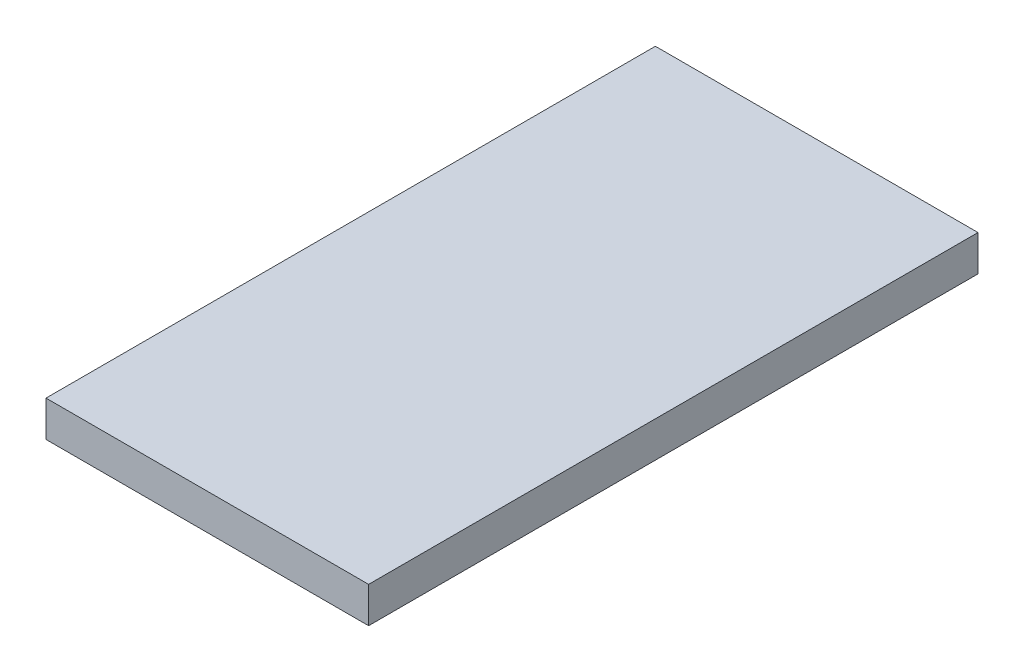
ISO-10303-21;
HEADER;
FILE_DESCRIPTION(('STEP AP214'),'2;1');
FILE_NAME('part.step','',(''),(''),'','','');
FILE_SCHEMA(('AUTOMOTIVE_DESIGN { 1 0 10303 214 1 1 1 1 }'));
ENDSEC;
DATA;
#1=APPLICATION_CONTEXT('core data for automotive mechanical design processes');
#2=APPLICATION_PROTOCOL_DEFINITION('international standard','automotive_design',2000,#1);
#3=PRODUCT_CONTEXT('',#1,'mechanical');
#4=PRODUCT('Part','Part','',(#3));
#5=PRODUCT_RELATED_PRODUCT_CATEGORY('part','',(#4));
#6=PRODUCT_DEFINITION_FORMATION('','',#4);
#7=PRODUCT_DEFINITION_CONTEXT('part definition',#1,'design');
#8=PRODUCT_DEFINITION('design','',#6,#7);
#9=PRODUCT_DEFINITION_SHAPE('','',#8);
#10=(LENGTH_UNIT() NAMED_UNIT(*) SI_UNIT(.MILLI.,.METRE.));
#11=(NAMED_UNIT(*) PLANE_ANGLE_UNIT() SI_UNIT($,.RADIAN.));
#12=(NAMED_UNIT(*) SI_UNIT($,.STERADIAN.) SOLID_ANGLE_UNIT());
#13=UNCERTAINTY_MEASURE_WITH_UNIT(LENGTH_MEASURE(1.E-05),#10,'distance_accuracy_value','');
#14=(GEOMETRIC_REPRESENTATION_CONTEXT(3) GLOBAL_UNCERTAINTY_ASSIGNED_CONTEXT((#13)) GLOBAL_UNIT_ASSIGNED_CONTEXT((#10,
#11,#12)) REPRESENTATION_CONTEXT('',''));
#15=CARTESIAN_POINT('',(0.,0.,0.));
#16=DIRECTION('',(0.,0.,1.));
#17=DIRECTION('',(1.,0.,0.));
#18=AXIS2_PLACEMENT_3D('',#15,#16,#17);
#19=CARTESIAN_POINT('',(-90.,0.,-340.));
#20=DIRECTION('',(-1.,0.,0.));
#21=DIRECTION('',(0.,0.,1.));
#22=AXIS2_PLACEMENT_3D('',#19,#20,#21);
#23=PLANE('',#22);
#24=DIRECTION('',(0.,-1.,0.));
#25=VECTOR('',#24,1.);
#26=CARTESIAN_POINT('',(-90.,0.,0.));
#27=LINE('',#26,#25);
#28=CARTESIAN_POINT('',(-90.,20.,0.));
#29=VERTEX_POINT('',#28);
#30=CARTESIAN_POINT('',(-90.,0.,0.));
#31=VERTEX_POINT('',#30);
#32=EDGE_CURVE('E103',#29,#31,#27,.T.);
#33=ORIENTED_EDGE('',*,*,#32,.F.);
#34=DIRECTION('',(0.,0.,1.));
#35=VECTOR('',#34,1.);
#36=CARTESIAN_POINT('',(-90.,20.,-340.));
#37=LINE('',#36,#35);
#38=CARTESIAN_POINT('',(-90.,20.,-340.));
#39=VERTEX_POINT('',#38);
#40=EDGE_CURVE('E11',#39,#29,#37,.T.);
#41=ORIENTED_EDGE('',*,*,#40,.F.);
#42=DIRECTION('',(0.,-1.,0.));
#43=VECTOR('',#42,1.);
#44=CARTESIAN_POINT('',(-90.,0.,-340.));
#45=LINE('',#44,#43);
#46=CARTESIAN_POINT('',(-90.,0.,-340.));
#47=VERTEX_POINT('',#46);
#48=EDGE_CURVE('E97',#39,#47,#45,.T.);
#49=ORIENTED_EDGE('',*,*,#48,.T.);
#50=DIRECTION('',(0.,0.,1.));
#51=VECTOR('',#50,1.);
#52=CARTESIAN_POINT('',(-90.,0.,-340.));
#53=LINE('',#52,#51);
#54=EDGE_CURVE('E42',#47,#31,#53,.T.);
#55=ORIENTED_EDGE('',*,*,#54,.T.);
#56=EDGE_LOOP('',(#33,#41,#49,#55));
#57=FACE_BOUND('',#56,.T.);
#58=ADVANCED_FACE('F39',(#57),#23,.T.);
#59=CARTESIAN_POINT('',(-90.,20.,-340.));
#60=DIRECTION('',(0.,1.,0.));
#61=DIRECTION('',(0.,0.,1.));
#62=AXIS2_PLACEMENT_3D('',#59,#60,#61);
#63=PLANE('',#62);
#64=DIRECTION('',(-1.,0.,0.));
#65=VECTOR('',#64,1.);
#66=CARTESIAN_POINT('',(-90.,20.,0.));
#67=LINE('',#66,#65);
#68=CARTESIAN_POINT('',(90.,20.,0.));
#69=VERTEX_POINT('',#68);
#70=EDGE_CURVE('E99',#69,#29,#67,.T.);
#71=ORIENTED_EDGE('',*,*,#70,.F.);
#72=DIRECTION('',(0.,0.,1.));
#73=VECTOR('',#72,1.);
#74=CARTESIAN_POINT('',(90.,20.,-340.));
#75=LINE('',#74,#73);
#76=CARTESIAN_POINT('',(90.,20.,-340.));
#77=VERTEX_POINT('',#76);
#78=EDGE_CURVE('E48',#77,#69,#75,.T.);
#79=ORIENTED_EDGE('',*,*,#78,.F.);
#80=DIRECTION('',(-1.,0.,0.));
#81=VECTOR('',#80,1.);
#82=CARTESIAN_POINT('',(-90.,20.,-340.));
#83=LINE('',#82,#81);
#84=EDGE_CURVE('E94',#77,#39,#83,.T.);
#85=ORIENTED_EDGE('',*,*,#84,.T.);
#86=ORIENTED_EDGE('',*,*,#40,.T.);
#87=EDGE_LOOP('',(#71,#79,#85,#86));
#88=FACE_BOUND('',#87,.T.);
#89=ADVANCED_FACE('F113',(#88),#63,.T.);
#90=CARTESIAN_POINT('',(90.,0.,-340.));
#91=DIRECTION('',(1.,0.,0.));
#92=DIRECTION('',(0.,0.,-1.));
#93=AXIS2_PLACEMENT_3D('',#90,#91,#92);
#94=PLANE('',#93);
#95=DIRECTION('',(0.,1.,0.));
#96=VECTOR('',#95,1.);
#97=CARTESIAN_POINT('',(90.,0.,0.));
#98=LINE('',#97,#96);
#99=CARTESIAN_POINT('',(90.,0.,0.));
#100=VERTEX_POINT('',#99);
#101=EDGE_CURVE('E89',#100,#69,#98,.T.);
#102=ORIENTED_EDGE('',*,*,#101,.F.);
#103=DIRECTION('',(0.,0.,1.));
#104=VECTOR('',#103,1.);
#105=CARTESIAN_POINT('',(90.,0.,-340.));
#106=LINE('',#105,#104);
#107=CARTESIAN_POINT('',(90.,0.,-340.));
#108=VERTEX_POINT('',#107);
#109=EDGE_CURVE('E84',#108,#100,#106,.T.);
#110=ORIENTED_EDGE('',*,*,#109,.F.);
#111=DIRECTION('',(0.,1.,0.));
#112=VECTOR('',#111,1.);
#113=CARTESIAN_POINT('',(90.,0.,-340.));
#114=LINE('',#113,#112);
#115=EDGE_CURVE('E87',#108,#77,#114,.T.);
#116=ORIENTED_EDGE('',*,*,#115,.T.);
#117=ORIENTED_EDGE('',*,*,#78,.T.);
#118=EDGE_LOOP('',(#102,#110,#116,#117));
#119=FACE_BOUND('',#118,.T.);
#120=ADVANCED_FACE('F86',(#119),#94,.T.);
#121=CARTESIAN_POINT('',(-90.,0.,-340.));
#122=DIRECTION('',(0.,-1.,0.));
#123=DIRECTION('',(0.,0.,-1.));
#124=AXIS2_PLACEMENT_3D('',#121,#122,#123);
#125=PLANE('',#124);
#126=DIRECTION('',(1.,0.,0.));
#127=VECTOR('',#126,1.);
#128=CARTESIAN_POINT('',(-90.,0.,0.));
#129=LINE('',#128,#127);
#130=EDGE_CURVE('E106',#31,#100,#129,.T.);
#131=ORIENTED_EDGE('',*,*,#130,.F.);
#132=ORIENTED_EDGE('',*,*,#54,.F.);
#133=DIRECTION('',(1.,0.,0.));
#134=VECTOR('',#133,1.);
#135=CARTESIAN_POINT('',(-90.,0.,-340.));
#136=LINE('',#135,#134);
#137=EDGE_CURVE('E93',#47,#108,#136,.T.);
#138=ORIENTED_EDGE('',*,*,#137,.T.);
#139=ORIENTED_EDGE('',*,*,#109,.T.);
#140=EDGE_LOOP('',(#131,#132,#138,#139));
#141=FACE_BOUND('',#140,.T.);
#142=ADVANCED_FACE('F96',(#141),#125,.T.);
#143=CARTESIAN_POINT('',(0.,0.,-340.));
#144=DIRECTION('',(0.,0.,-1.));
#145=DIRECTION('',(-1.,0.,0.));
#146=AXIS2_PLACEMENT_3D('',#143,#144,#145);
#147=PLANE('',#146);
#148=ORIENTED_EDGE('',*,*,#48,.F.);
#149=ORIENTED_EDGE('',*,*,#84,.F.);
#150=ORIENTED_EDGE('',*,*,#115,.F.);
#151=ORIENTED_EDGE('',*,*,#137,.F.);
#152=EDGE_LOOP('',(#148,#149,#150,#151));
#153=FACE_BOUND('',#152,.T.);
#154=ADVANCED_FACE('F92',(#153),#147,.T.);
#155=CARTESIAN_POINT('',(0.,0.,0.));
#156=DIRECTION('',(0.,0.,-1.));
#157=DIRECTION('',(-1.,0.,0.));
#158=AXIS2_PLACEMENT_3D('',#155,#156,#157);
#159=PLANE('',#158);
#160=ORIENTED_EDGE('',*,*,#32,.T.);
#161=ORIENTED_EDGE('',*,*,#130,.T.);
#162=ORIENTED_EDGE('',*,*,#101,.T.);
#163=ORIENTED_EDGE('',*,*,#70,.T.);
#164=EDGE_LOOP('',(#160,#161,#162,#163));
#165=FACE_BOUND('',#164,.T.);
#166=ADVANCED_FACE('F112',(#165),#159,.F.);
#167=CLOSED_SHELL('',(#58,#89,#120,#142,#154,#166));
#168=MANIFOLD_SOLID_BREP('B2',#167);
#169=ADVANCED_BREP_SHAPE_REPRESENTATION('',(#18,#168),#14);
#170=SHAPE_DEFINITION_REPRESENTATION(#9,#169);
ENDSEC;
END-ISO-10303-21;
